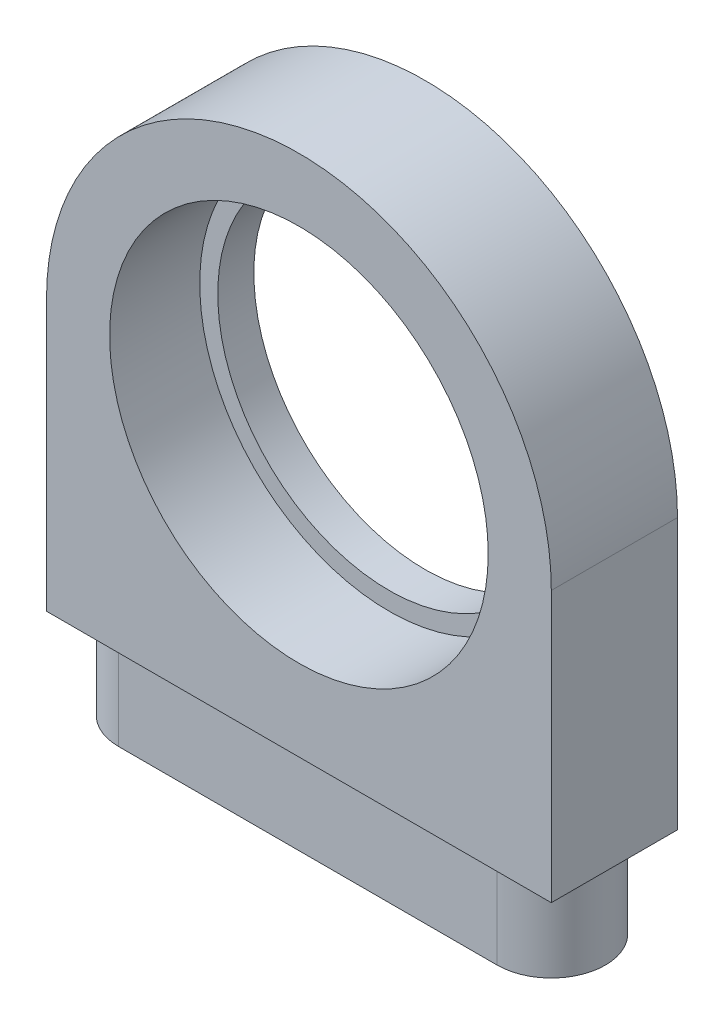
ISO-10303-21;
HEADER;
FILE_DESCRIPTION(('STEP AP214'),'2;1');
FILE_NAME('part.step','',(''),(''),'','','');
FILE_SCHEMA(('AUTOMOTIVE_DESIGN { 1 0 10303 214 1 1 1 1 }'));
ENDSEC;
DATA;
#1=APPLICATION_CONTEXT('core data for automotive mechanical design processes');
#2=APPLICATION_PROTOCOL_DEFINITION('international standard','automotive_design',2000,#1);
#3=PRODUCT_CONTEXT('',#1,'mechanical');
#4=PRODUCT('Part','Part','',(#3));
#5=PRODUCT_RELATED_PRODUCT_CATEGORY('part','',(#4));
#6=PRODUCT_DEFINITION_FORMATION('','',#4);
#7=PRODUCT_DEFINITION_CONTEXT('part definition',#1,'design');
#8=PRODUCT_DEFINITION('design','',#6,#7);
#9=PRODUCT_DEFINITION_SHAPE('','',#8);
#10=(LENGTH_UNIT() NAMED_UNIT(*) SI_UNIT(.MILLI.,.METRE.));
#11=(NAMED_UNIT(*) PLANE_ANGLE_UNIT() SI_UNIT($,.RADIAN.));
#12=(NAMED_UNIT(*) SI_UNIT($,.STERADIAN.) SOLID_ANGLE_UNIT());
#13=UNCERTAINTY_MEASURE_WITH_UNIT(LENGTH_MEASURE(1.E-05),#10,'distance_accuracy_value','');
#14=(GEOMETRIC_REPRESENTATION_CONTEXT(3) GLOBAL_UNCERTAINTY_ASSIGNED_CONTEXT((#13)) GLOBAL_UNIT_ASSIGNED_CONTEXT((#10,
#11,#12)) REPRESENTATION_CONTEXT('',''));
#15=CARTESIAN_POINT('',(0.,0.,0.));
#16=DIRECTION('',(0.,0.,1.));
#17=DIRECTION('',(1.,0.,0.));
#18=AXIS2_PLACEMENT_3D('',#15,#16,#17);
#19=CARTESIAN_POINT('',(14.,29.,-3.5));
#20=DIRECTION('',(-1.,0.,0.));
#21=DIRECTION('',(0.,0.,1.));
#22=AXIS2_PLACEMENT_3D('',#19,#20,#21);
#23=PLANE('',#22);
#24=DIRECTION('',(0.,0.,1.));
#25=VECTOR('',#24,1.);
#26=CARTESIAN_POINT('',(14.,15.,-3.5));
#27=LINE('',#26,#25);
#28=CARTESIAN_POINT('',(14.,15.,-3.5));
#29=VERTEX_POINT('',#28);
#30=CARTESIAN_POINT('',(14.,15.,3.5));
#31=VERTEX_POINT('',#30);
#32=EDGE_CURVE('E107',#29,#31,#27,.T.);
#33=ORIENTED_EDGE('',*,*,#32,.T.);
#34=DIRECTION('',(0.,-1.,0.));
#35=VECTOR('',#34,1.);
#36=CARTESIAN_POINT('',(14.,29.,3.5));
#37=LINE('',#36,#35);
#38=CARTESIAN_POINT('',(14.,0.,3.5));
#39=VERTEX_POINT('',#38);
#40=EDGE_CURVE('E206',#31,#39,#37,.T.);
#41=ORIENTED_EDGE('',*,*,#40,.T.);
#42=DIRECTION('',(0.,0.,-1.));
#43=VECTOR('',#42,1.);
#44=CARTESIAN_POINT('',(14.,0.,-3.5));
#45=LINE('',#44,#43);
#46=CARTESIAN_POINT('',(14.,0.,-3.5));
#47=VERTEX_POINT('',#46);
#48=EDGE_CURVE('E126',#39,#47,#45,.T.);
#49=ORIENTED_EDGE('',*,*,#48,.T.);
#50=DIRECTION('',(0.,-1.,0.));
#51=VECTOR('',#50,1.);
#52=CARTESIAN_POINT('',(14.,29.,-3.5));
#53=LINE('',#52,#51);
#54=EDGE_CURVE('E120',#29,#47,#53,.T.);
#55=ORIENTED_EDGE('',*,*,#54,.F.);
#56=EDGE_LOOP('',(#33,#41,#49,#55));
#57=FACE_BOUND('',#56,.T.);
#58=ADVANCED_FACE('F34',(#57),#23,.F.);
#59=CARTESIAN_POINT('',(-10.5,-5.,0.));
#60=DIRECTION('',(0.,1.,0.));
#61=DIRECTION('',(0.,0.,1.));
#62=AXIS2_PLACEMENT_3D('',#59,#60,#61);
#63=CYLINDRICAL_SURFACE('',#62,3.);
#64=CARTESIAN_POINT('',(-10.5,0.,0.));
#65=DIRECTION('',(0.,1.,0.));
#66=DIRECTION('',(0.,0.,1.));
#67=AXIS2_PLACEMENT_3D('',#64,#65,#66);
#68=CIRCLE('',#67,3.);
#69=CARTESIAN_POINT('',(-10.5,0.,-3.));
#70=VERTEX_POINT('',#69);
#71=CARTESIAN_POINT('',(-10.5,0.,3.));
#72=VERTEX_POINT('',#71);
#73=EDGE_CURVE('E127',#70,#72,#68,.T.);
#74=ORIENTED_EDGE('',*,*,#73,.F.);
#75=DIRECTION('',(0.,1.,0.));
#76=VECTOR('',#75,1.);
#77=CARTESIAN_POINT('',(-10.5,-5.,-3.));
#78=LINE('',#77,#76);
#79=CARTESIAN_POINT('',(-10.5,-5.,-3.));
#80=VERTEX_POINT('',#79);
#81=EDGE_CURVE('E11',#80,#70,#78,.T.);
#82=ORIENTED_EDGE('',*,*,#81,.F.);
#83=CARTESIAN_POINT('',(-10.5,-5.,0.));
#84=DIRECTION('',(0.,1.,0.));
#85=DIRECTION('',(0.,0.,1.));
#86=AXIS2_PLACEMENT_3D('',#83,#84,#85);
#87=CIRCLE('',#86,3.);
#88=CARTESIAN_POINT('',(-10.5,-5.,3.));
#89=VERTEX_POINT('',#88);
#90=EDGE_CURVE('E136',#80,#89,#87,.T.);
#91=ORIENTED_EDGE('',*,*,#90,.T.);
#92=DIRECTION('',(0.,1.,0.));
#93=VECTOR('',#92,1.);
#94=CARTESIAN_POINT('',(-10.5,-5.,3.));
#95=LINE('',#94,#93);
#96=EDGE_CURVE('E38',#89,#72,#95,.T.);
#97=ORIENTED_EDGE('',*,*,#96,.T.);
#98=EDGE_LOOP('',(#74,#82,#91,#97));
#99=FACE_BOUND('',#98,.T.);
#100=ADVANCED_FACE('F36',(#99),#63,.T.);
#101=CARTESIAN_POINT('',(-10.5,-5.,-3.));
#102=DIRECTION('',(0.,0.,-1.));
#103=DIRECTION('',(-1.,0.,0.));
#104=AXIS2_PLACEMENT_3D('',#101,#102,#103);
#105=PLANE('',#104);
#106=DIRECTION('',(-1.,0.,0.));
#107=VECTOR('',#106,1.);
#108=CARTESIAN_POINT('',(-10.5,0.,-3.));
#109=LINE('',#108,#107);
#110=CARTESIAN_POINT('',(10.5,0.,-3.00000000000001));
#111=VERTEX_POINT('',#110);
#112=EDGE_CURVE('E139',#111,#70,#109,.T.);
#113=ORIENTED_EDGE('',*,*,#112,.F.);
#114=DIRECTION('',(0.,1.,0.));
#115=VECTOR('',#114,1.);
#116=CARTESIAN_POINT('',(10.5,-5.,-3.00000000000001));
#117=LINE('',#116,#115);
#118=CARTESIAN_POINT('',(10.5,-5.,-3.00000000000001));
#119=VERTEX_POINT('',#118);
#120=EDGE_CURVE('E43',#119,#111,#117,.T.);
#121=ORIENTED_EDGE('',*,*,#120,.F.);
#122=DIRECTION('',(-1.,0.,0.));
#123=VECTOR('',#122,1.);
#124=CARTESIAN_POINT('',(-10.5,-5.,-3.));
#125=LINE('',#124,#123);
#126=EDGE_CURVE('E143',#119,#80,#125,.T.);
#127=ORIENTED_EDGE('',*,*,#126,.T.);
#128=ORIENTED_EDGE('',*,*,#81,.T.);
#129=EDGE_LOOP('',(#113,#121,#127,#128));
#130=FACE_BOUND('',#129,.T.);
#131=ADVANCED_FACE('F158',(#130),#105,.T.);
#132=CARTESIAN_POINT('',(10.5,-5.,0.));
#133=DIRECTION('',(0.,1.,0.));
#134=DIRECTION('',(0.,0.,1.));
#135=AXIS2_PLACEMENT_3D('',#132,#133,#134);
#136=CYLINDRICAL_SURFACE('',#135,3.);
#137=CARTESIAN_POINT('',(10.5,0.,0.));
#138=DIRECTION('',(0.,1.,0.));
#139=DIRECTION('',(0.,0.,1.));
#140=AXIS2_PLACEMENT_3D('',#137,#138,#139);
#141=CIRCLE('',#140,3.);
#142=CARTESIAN_POINT('',(10.5,0.,3.));
#143=VERTEX_POINT('',#142);
#144=EDGE_CURVE('E148',#143,#111,#141,.T.);
#145=ORIENTED_EDGE('',*,*,#144,.F.);
#146=DIRECTION('',(0.,1.,0.));
#147=VECTOR('',#146,1.);
#148=CARTESIAN_POINT('',(10.5,-5.,3.));
#149=LINE('',#148,#147);
#150=CARTESIAN_POINT('',(10.5,-5.,3.));
#151=VERTEX_POINT('',#150);
#152=EDGE_CURVE('E153',#151,#143,#149,.T.);
#153=ORIENTED_EDGE('',*,*,#152,.F.);
#154=CARTESIAN_POINT('',(10.5,-5.,0.));
#155=DIRECTION('',(0.,1.,0.));
#156=DIRECTION('',(0.,0.,1.));
#157=AXIS2_PLACEMENT_3D('',#154,#155,#156);
#158=CIRCLE('',#157,3.);
#159=EDGE_CURVE('E141',#151,#119,#158,.T.);
#160=ORIENTED_EDGE('',*,*,#159,.T.);
#161=ORIENTED_EDGE('',*,*,#120,.T.);
#162=EDGE_LOOP('',(#145,#153,#160,#161));
#163=FACE_BOUND('',#162,.T.);
#164=ADVANCED_FACE('F163',(#163),#136,.T.);
#165=CARTESIAN_POINT('',(-10.5,-5.,3.));
#166=DIRECTION('',(0.,0.,1.));
#167=DIRECTION('',(1.,0.,0.));
#168=AXIS2_PLACEMENT_3D('',#165,#166,#167);
#169=PLANE('',#168);
#170=DIRECTION('',(1.,0.,0.));
#171=VECTOR('',#170,1.);
#172=CARTESIAN_POINT('',(-10.5,0.,3.));
#173=LINE('',#172,#171);
#174=EDGE_CURVE('E130',#72,#143,#173,.T.);
#175=ORIENTED_EDGE('',*,*,#174,.F.);
#176=ORIENTED_EDGE('',*,*,#96,.F.);
#177=DIRECTION('',(1.,0.,0.));
#178=VECTOR('',#177,1.);
#179=CARTESIAN_POINT('',(-10.5,-5.,3.));
#180=LINE('',#179,#178);
#181=EDGE_CURVE('E138',#89,#151,#180,.T.);
#182=ORIENTED_EDGE('',*,*,#181,.T.);
#183=ORIENTED_EDGE('',*,*,#152,.T.);
#184=EDGE_LOOP('',(#175,#176,#182,#183));
#185=FACE_BOUND('',#184,.T.);
#186=ADVANCED_FACE('F154',(#185),#169,.T.);
#187=CARTESIAN_POINT('',(-10.5,-5.,0.));
#188=DIRECTION('',(0.,1.,0.));
#189=DIRECTION('',(0.,0.,1.));
#190=AXIS2_PLACEMENT_3D('',#187,#188,#189);
#191=PLANE('',#190);
#192=ORIENTED_EDGE('',*,*,#90,.F.);
#193=ORIENTED_EDGE('',*,*,#126,.F.);
#194=ORIENTED_EDGE('',*,*,#159,.F.);
#195=ORIENTED_EDGE('',*,*,#181,.F.);
#196=EDGE_LOOP('',(#192,#193,#194,#195));
#197=FACE_BOUND('',#196,.T.);
#198=ADVANCED_FACE('F162',(#197),#191,.F.);
#199=CARTESIAN_POINT('',(0.,0.,0.));
#200=DIRECTION('',(0.,1.,0.));
#201=DIRECTION('',(0.,0.,1.));
#202=AXIS2_PLACEMENT_3D('',#199,#200,#201);
#203=PLANE('',#202);
#204=ORIENTED_EDGE('',*,*,#48,.F.);
#205=DIRECTION('',(1.,0.,0.));
#206=VECTOR('',#205,1.);
#207=CARTESIAN_POINT('',(-14.,0.,3.5));
#208=LINE('',#207,#206);
#209=CARTESIAN_POINT('',(-14.,0.,3.5));
#210=VERTEX_POINT('',#209);
#211=EDGE_CURVE('E207',#210,#39,#208,.T.);
#212=ORIENTED_EDGE('',*,*,#211,.F.);
#213=DIRECTION('',(0.,0.,1.));
#214=VECTOR('',#213,1.);
#215=CARTESIAN_POINT('',(-14.,0.,-3.5));
#216=LINE('',#215,#214);
#217=CARTESIAN_POINT('',(-14.,0.,-3.5));
#218=VERTEX_POINT('',#217);
#219=EDGE_CURVE('E203',#218,#210,#216,.T.);
#220=ORIENTED_EDGE('',*,*,#219,.F.);
#221=DIRECTION('',(-1.,0.,0.));
#222=VECTOR('',#221,1.);
#223=CARTESIAN_POINT('',(-14.,0.,-3.5));
#224=LINE('',#223,#222);
#225=EDGE_CURVE('E212',#47,#218,#224,.T.);
#226=ORIENTED_EDGE('',*,*,#225,.F.);
#227=EDGE_LOOP('',(#204,#212,#220,#226));
#228=FACE_BOUND('',#227,.T.);
#229=ORIENTED_EDGE('',*,*,#112,.T.);
#230=ORIENTED_EDGE('',*,*,#73,.T.);
#231=ORIENTED_EDGE('',*,*,#174,.T.);
#232=ORIENTED_EDGE('',*,*,#144,.T.);
#233=EDGE_LOOP('',(#229,#230,#231,#232));
#234=FACE_BOUND('',#233,.T.);
#235=ADVANCED_FACE('F156',(#228,#234),#203,.F.);
#236=CARTESIAN_POINT('',(-14.,29.,-3.5));
#237=DIRECTION('',(0.,0.,1.));
#238=DIRECTION('',(1.,0.,0.));
#239=AXIS2_PLACEMENT_3D('',#236,#237,#238);
#240=PLANE('',#239);
#241=CARTESIAN_POINT('',(0.,15.,-3.5));
#242=DIRECTION('',(0.,0.,1.));
#243=DIRECTION('',(1.,0.,0.));
#244=AXIS2_PLACEMENT_3D('',#241,#242,#243);
#245=CIRCLE('',#244,9.5);
#246=CARTESIAN_POINT('',(9.5,15.,-3.5));
#247=VERTEX_POINT('',#246);
#248=EDGE_CURVE('E221',#247,#247,#245,.T.);
#249=ORIENTED_EDGE('',*,*,#248,.T.);
#250=EDGE_LOOP('',(#249));
#251=FACE_BOUND('',#250,.T.);
#252=DIRECTION('',(0.,-1.,0.));
#253=VECTOR('',#252,1.);
#254=CARTESIAN_POINT('',(-14.,29.,-3.5));
#255=LINE('',#254,#253);
#256=CARTESIAN_POINT('',(-14.,15.,-3.5));
#257=VERTEX_POINT('',#256);
#258=EDGE_CURVE('E122',#257,#218,#255,.T.);
#259=ORIENTED_EDGE('',*,*,#258,.F.);
#260=CARTESIAN_POINT('',(0.,15.,-3.5));
#261=DIRECTION('',(0.,0.,-1.));
#262=DIRECTION('',(-1.,0.,0.));
#263=AXIS2_PLACEMENT_3D('',#260,#261,#262);
#264=CIRCLE('',#263,14.);
#265=EDGE_CURVE('E110',#257,#29,#264,.T.);
#266=ORIENTED_EDGE('',*,*,#265,.T.);
#267=ORIENTED_EDGE('',*,*,#54,.T.);
#268=ORIENTED_EDGE('',*,*,#225,.T.);
#269=EDGE_LOOP('',(#259,#266,#267,#268));
#270=FACE_BOUND('',#269,.T.);
#271=ADVANCED_FACE('F118',(#251,#270),#240,.F.);
#272=CARTESIAN_POINT('',(-14.,29.,-3.5));
#273=DIRECTION('',(1.,0.,0.));
#274=DIRECTION('',(0.,0.,-1.));
#275=AXIS2_PLACEMENT_3D('',#272,#273,#274);
#276=PLANE('',#275);
#277=DIRECTION('',(0.,-1.,0.));
#278=VECTOR('',#277,1.);
#279=CARTESIAN_POINT('',(-14.,29.,3.5));
#280=LINE('',#279,#278);
#281=CARTESIAN_POINT('',(-14.,15.,3.5));
#282=VERTEX_POINT('',#281);
#283=EDGE_CURVE('E132',#282,#210,#280,.T.);
#284=ORIENTED_EDGE('',*,*,#283,.F.);
#285=DIRECTION('',(0.,0.,1.));
#286=VECTOR('',#285,1.);
#287=CARTESIAN_POINT('',(-14.,15.,-3.5));
#288=LINE('',#287,#286);
#289=EDGE_CURVE('E114',#257,#282,#288,.T.);
#290=ORIENTED_EDGE('',*,*,#289,.F.);
#291=ORIENTED_EDGE('',*,*,#258,.T.);
#292=ORIENTED_EDGE('',*,*,#219,.T.);
#293=EDGE_LOOP('',(#284,#290,#291,#292));
#294=FACE_BOUND('',#293,.T.);
#295=ADVANCED_FACE('F188',(#294),#276,.F.);
#296=CARTESIAN_POINT('',(-14.,29.,3.5));
#297=DIRECTION('',(0.,0.,-1.));
#298=DIRECTION('',(-1.,0.,0.));
#299=AXIS2_PLACEMENT_3D('',#296,#297,#298);
#300=PLANE('',#299);
#301=CARTESIAN_POINT('',(0.,15.,3.5));
#302=DIRECTION('',(0.,0.,1.));
#303=DIRECTION('',(1.,0.,0.));
#304=AXIS2_PLACEMENT_3D('',#301,#302,#303);
#305=CIRCLE('',#304,10.5);
#306=CARTESIAN_POINT('',(10.5,15.,3.5));
#307=VERTEX_POINT('',#306);
#308=EDGE_CURVE('E218',#307,#307,#305,.T.);
#309=ORIENTED_EDGE('',*,*,#308,.F.);
#310=EDGE_LOOP('',(#309));
#311=FACE_BOUND('',#310,.T.);
#312=ORIENTED_EDGE('',*,*,#40,.F.);
#313=CARTESIAN_POINT('',(0.,15.,3.5));
#314=DIRECTION('',(0.,0.,-1.));
#315=DIRECTION('',(-1.,0.,0.));
#316=AXIS2_PLACEMENT_3D('',#313,#314,#315);
#317=CIRCLE('',#316,14.);
#318=EDGE_CURVE('E51',#282,#31,#317,.T.);
#319=ORIENTED_EDGE('',*,*,#318,.F.);
#320=ORIENTED_EDGE('',*,*,#283,.T.);
#321=ORIENTED_EDGE('',*,*,#211,.T.);
#322=EDGE_LOOP('',(#312,#319,#320,#321));
#323=FACE_BOUND('',#322,.T.);
#324=ADVANCED_FACE('F193',(#311,#323),#300,.F.);
#325=CARTESIAN_POINT('',(0.,15.,-3.5));
#326=DIRECTION('',(0.,0.,1.));
#327=DIRECTION('',(1.,0.,0.));
#328=AXIS2_PLACEMENT_3D('',#325,#326,#327);
#329=CYLINDRICAL_SURFACE('',#328,14.);
#330=ORIENTED_EDGE('',*,*,#318,.T.);
#331=ORIENTED_EDGE('',*,*,#32,.F.);
#332=ORIENTED_EDGE('',*,*,#265,.F.);
#333=ORIENTED_EDGE('',*,*,#289,.T.);
#334=EDGE_LOOP('',(#330,#331,#332,#333));
#335=FACE_BOUND('',#334,.T.);
#336=ADVANCED_FACE('F109',(#335),#329,.T.);
#337=CARTESIAN_POINT('',(0.,15.,-1.5));
#338=DIRECTION('',(0.,0.,1.));
#339=DIRECTION('',(1.,0.,0.));
#340=AXIS2_PLACEMENT_3D('',#337,#338,#339);
#341=CYLINDRICAL_SURFACE('',#340,10.5);
#342=CARTESIAN_POINT('',(0.,15.,-1.5));
#343=DIRECTION('',(0.,0.,1.));
#344=DIRECTION('',(1.,0.,0.));
#345=AXIS2_PLACEMENT_3D('',#342,#343,#344);
#346=CIRCLE('',#345,10.5);
#347=CARTESIAN_POINT('',(10.5,15.,-1.5));
#348=VERTEX_POINT('',#347);
#349=EDGE_CURVE('E216',#348,#348,#346,.T.);
#350=ORIENTED_EDGE('',*,*,#349,.F.);
#351=EDGE_LOOP('',(#350));
#352=FACE_BOUND('',#351,.T.);
#353=ORIENTED_EDGE('',*,*,#308,.T.);
#354=EDGE_LOOP('',(#353));
#355=FACE_BOUND('',#354,.T.);
#356=ADVANCED_FACE('F239',(#352,#355),#341,.F.);
#357=CARTESIAN_POINT('',(0.,15.,-1.5));
#358=DIRECTION('',(0.,0.,1.));
#359=DIRECTION('',(1.,0.,0.));
#360=AXIS2_PLACEMENT_3D('',#357,#358,#359);
#361=PLANE('',#360);
#362=CARTESIAN_POINT('',(0.,15.,-1.5));
#363=DIRECTION('',(0.,0.,1.));
#364=DIRECTION('',(1.,0.,0.));
#365=AXIS2_PLACEMENT_3D('',#362,#363,#364);
#366=CIRCLE('',#365,9.5);
#367=CARTESIAN_POINT('',(9.5,15.,-1.5));
#368=VERTEX_POINT('',#367);
#369=EDGE_CURVE('E224',#368,#368,#366,.T.);
#370=ORIENTED_EDGE('',*,*,#369,.F.);
#371=EDGE_LOOP('',(#370));
#372=FACE_BOUND('',#371,.T.);
#373=ORIENTED_EDGE('',*,*,#349,.T.);
#374=EDGE_LOOP('',(#373));
#375=FACE_BOUND('',#374,.T.);
#376=ADVANCED_FACE('F233',(#372,#375),#361,.T.);
#377=CARTESIAN_POINT('',(0.,15.,-3.5));
#378=DIRECTION('',(0.,0.,1.));
#379=DIRECTION('',(1.,0.,0.));
#380=AXIS2_PLACEMENT_3D('',#377,#378,#379);
#381=CYLINDRICAL_SURFACE('',#380,9.5);
#382=ORIENTED_EDGE('',*,*,#248,.F.);
#383=EDGE_LOOP('',(#382));
#384=FACE_BOUND('',#383,.T.);
#385=ORIENTED_EDGE('',*,*,#369,.T.);
#386=EDGE_LOOP('',(#385));
#387=FACE_BOUND('',#386,.T.);
#388=ADVANCED_FACE('F230',(#384,#387),#381,.F.);
#389=CLOSED_SHELL('',(#58,#100,#131,#164,#186,#198,#235,#271,#295,#324,#336,#356,#376,#388));
#390=MANIFOLD_SOLID_BREP('B2',#389);
#391=ADVANCED_BREP_SHAPE_REPRESENTATION('',(#18,#390),#14);
#392=SHAPE_DEFINITION_REPRESENTATION(#9,#391);
ENDSEC;
END-ISO-10303-21;
